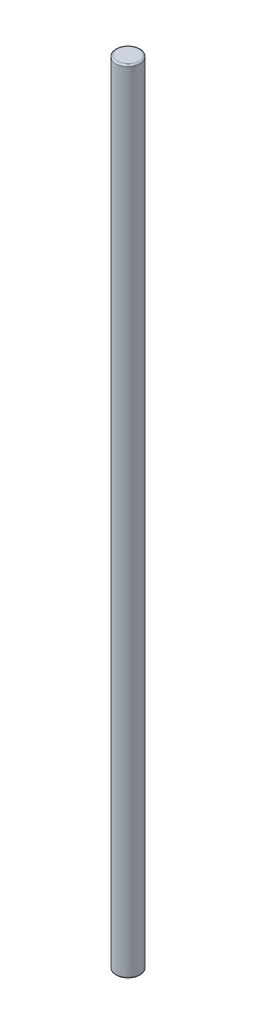
ISO-10303-21;
HEADER;
FILE_DESCRIPTION(('STEP AP214'),'2;1');
FILE_NAME('part.step','',(''),(''),'','','');
FILE_SCHEMA(('AUTOMOTIVE_DESIGN { 1 0 10303 214 1 1 1 1 }'));
ENDSEC;
DATA;
#1=APPLICATION_CONTEXT('core data for automotive mechanical design processes');
#2=APPLICATION_PROTOCOL_DEFINITION('international standard','automotive_design',2000,#1);
#3=PRODUCT_CONTEXT('',#1,'mechanical');
#4=PRODUCT('Part','Part','',(#3));
#5=PRODUCT_RELATED_PRODUCT_CATEGORY('part','',(#4));
#6=PRODUCT_DEFINITION_FORMATION('','',#4);
#7=PRODUCT_DEFINITION_CONTEXT('part definition',#1,'design');
#8=PRODUCT_DEFINITION('design','',#6,#7);
#9=PRODUCT_DEFINITION_SHAPE('','',#8);
#10=(LENGTH_UNIT() NAMED_UNIT(*) SI_UNIT(.MILLI.,.METRE.));
#11=(NAMED_UNIT(*) PLANE_ANGLE_UNIT() SI_UNIT($,.RADIAN.));
#12=(NAMED_UNIT(*) SI_UNIT($,.STERADIAN.) SOLID_ANGLE_UNIT());
#13=UNCERTAINTY_MEASURE_WITH_UNIT(LENGTH_MEASURE(1.E-05),#10,'distance_accuracy_value','');
#14=(GEOMETRIC_REPRESENTATION_CONTEXT(3) GLOBAL_UNCERTAINTY_ASSIGNED_CONTEXT((#13)) GLOBAL_UNIT_ASSIGNED_CONTEXT((#10,
#11,#12)) REPRESENTATION_CONTEXT('',''));
#15=CARTESIAN_POINT('',(0.,0.,0.));
#16=DIRECTION('',(0.,0.,1.));
#17=DIRECTION('',(1.,0.,0.));
#18=AXIS2_PLACEMENT_3D('',#15,#16,#17);
#19=CARTESIAN_POINT('',(0.,130.,0.));
#20=DIRECTION('',(0.,-1.,0.));
#21=DIRECTION('',(0.,0.,-1.));
#22=AXIS2_PLACEMENT_3D('',#19,#20,#21);
#23=CYLINDRICAL_SURFACE('',#22,2.);
#24=CARTESIAN_POINT('',(0.,0.25,0.));
#25=DIRECTION('',(0.,1.,0.));
#26=DIRECTION('',(0.,0.,1.));
#27=AXIS2_PLACEMENT_3D('',#24,#25,#26);
#28=CIRCLE('',#27,2.);
#29=CARTESIAN_POINT('',(0.,0.25,2.));
#30=VERTEX_POINT('',#29);
#31=EDGE_CURVE('E42',#30,#30,#28,.T.);
#32=ORIENTED_EDGE('',*,*,#31,.T.);
#33=EDGE_LOOP('',(#32));
#34=FACE_BOUND('',#33,.T.);
#35=CARTESIAN_POINT('',(0.,129.75,0.));
#36=DIRECTION('',(0.,1.,0.));
#37=DIRECTION('',(0.,0.,1.));
#38=AXIS2_PLACEMENT_3D('',#35,#36,#37);
#39=CIRCLE('',#38,2.);
#40=CARTESIAN_POINT('',(0.,129.75,2.));
#41=VERTEX_POINT('',#40);
#42=EDGE_CURVE('E46',#41,#41,#39,.F.);
#43=ORIENTED_EDGE('',*,*,#42,.T.);
#44=EDGE_LOOP('',(#43));
#45=FACE_BOUND('',#44,.T.);
#46=ADVANCED_FACE('F31',(#34,#45),#23,.T.);
#47=CARTESIAN_POINT('',(0.,130.,0.));
#48=DIRECTION('',(0.,1.,0.));
#49=DIRECTION('',(0.,0.,1.));
#50=AXIS2_PLACEMENT_3D('',#47,#48,#49);
#51=PLANE('',#50);
#52=CARTESIAN_POINT('',(0.,130.,0.));
#53=DIRECTION('',(0.,1.,0.));
#54=DIRECTION('',(0.,0.,1.));
#55=AXIS2_PLACEMENT_3D('',#52,#53,#54);
#56=CIRCLE('',#55,1.75);
#57=CARTESIAN_POINT('',(0.,130.,1.75));
#58=VERTEX_POINT('',#57);
#59=EDGE_CURVE('E10',#58,#58,#56,.T.);
#60=ORIENTED_EDGE('',*,*,#59,.T.);
#61=EDGE_LOOP('',(#60));
#62=FACE_BOUND('',#61,.T.);
#63=ADVANCED_FACE('F62',(#62),#51,.T.);
#64=CARTESIAN_POINT('',(0.,0.,0.));
#65=DIRECTION('',(0.,1.,0.));
#66=DIRECTION('',(0.,0.,1.));
#67=AXIS2_PLACEMENT_3D('',#64,#65,#66);
#68=PLANE('',#67);
#69=CARTESIAN_POINT('',(0.,0.,0.));
#70=DIRECTION('',(0.,1.,0.));
#71=DIRECTION('',(0.,0.,1.));
#72=AXIS2_PLACEMENT_3D('',#69,#70,#71);
#73=CIRCLE('',#72,1.75);
#74=CARTESIAN_POINT('',(0.,0.,1.75));
#75=VERTEX_POINT('',#74);
#76=EDGE_CURVE('E38',#75,#75,#73,.F.);
#77=ORIENTED_EDGE('',*,*,#76,.T.);
#78=EDGE_LOOP('',(#77));
#79=FACE_BOUND('',#78,.T.);
#80=ADVANCED_FACE('F59',(#79),#68,.F.);
#81=CARTESIAN_POINT('',(0.,0.25,0.));
#82=DIRECTION('',(0.,1.,0.));
#83=DIRECTION('',(0.,0.,1.));
#84=AXIS2_PLACEMENT_3D('',#81,#82,#83);
#85=TOROIDAL_SURFACE('',#84,1.75,0.25);
#86=ORIENTED_EDGE('',*,*,#76,.F.);
#87=EDGE_LOOP('',(#86));
#88=FACE_BOUND('',#87,.T.);
#89=ORIENTED_EDGE('',*,*,#31,.F.);
#90=EDGE_LOOP('',(#89));
#91=FACE_BOUND('',#90,.T.);
#92=ADVANCED_FACE('F55',(#88,#91),#85,.T.);
#93=CARTESIAN_POINT('',(0.,129.75,0.));
#94=DIRECTION('',(0.,1.,0.));
#95=DIRECTION('',(0.,0.,1.));
#96=AXIS2_PLACEMENT_3D('',#93,#94,#95);
#97=TOROIDAL_SURFACE('',#96,1.75,0.25);
#98=ORIENTED_EDGE('',*,*,#42,.F.);
#99=EDGE_LOOP('',(#98));
#100=FACE_BOUND('',#99,.T.);
#101=ORIENTED_EDGE('',*,*,#59,.F.);
#102=EDGE_LOOP('',(#101));
#103=FACE_BOUND('',#102,.T.);
#104=ADVANCED_FACE('F33',(#100,#103),#97,.T.);
#105=CLOSED_SHELL('',(#46,#63,#80,#92,#104));
#106=MANIFOLD_SOLID_BREP('B2',#105);
#107=ADVANCED_BREP_SHAPE_REPRESENTATION('',(#18,#106),#14);
#108=SHAPE_DEFINITION_REPRESENTATION(#9,#107);
ENDSEC;
END-ISO-10303-21;
